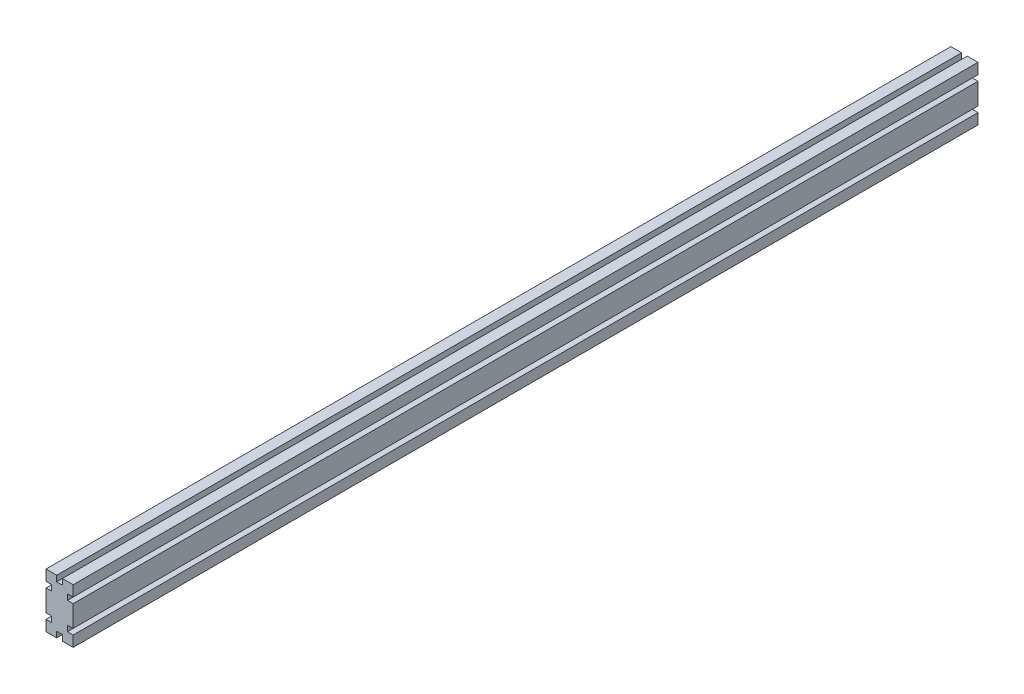
ISO-10303-21;
HEADER;
FILE_DESCRIPTION(('STEP AP214'),'2;1');
FILE_NAME('part.step','',(''),(''),'','','');
FILE_SCHEMA(('AUTOMOTIVE_DESIGN { 1 0 10303 214 1 1 1 1 }'));
ENDSEC;
DATA;
#1=APPLICATION_CONTEXT('core data for automotive mechanical design processes');
#2=APPLICATION_PROTOCOL_DEFINITION('international standard','automotive_design',2000,#1);
#3=PRODUCT_CONTEXT('',#1,'mechanical');
#4=PRODUCT('Part','Part','',(#3));
#5=PRODUCT_RELATED_PRODUCT_CATEGORY('part','',(#4));
#6=PRODUCT_DEFINITION_FORMATION('','',#4);
#7=PRODUCT_DEFINITION_CONTEXT('part definition',#1,'design');
#8=PRODUCT_DEFINITION('design','',#6,#7);
#9=PRODUCT_DEFINITION_SHAPE('','',#8);
#10=(LENGTH_UNIT() NAMED_UNIT(*) SI_UNIT(.MILLI.,.METRE.));
#11=(NAMED_UNIT(*) PLANE_ANGLE_UNIT() SI_UNIT($,.RADIAN.));
#12=(NAMED_UNIT(*) SI_UNIT($,.STERADIAN.) SOLID_ANGLE_UNIT());
#13=UNCERTAINTY_MEASURE_WITH_UNIT(LENGTH_MEASURE(1.E-05),#10,'distance_accuracy_value','');
#14=(GEOMETRIC_REPRESENTATION_CONTEXT(3) GLOBAL_UNCERTAINTY_ASSIGNED_CONTEXT((#13)) GLOBAL_UNIT_ASSIGNED_CONTEXT((#10,
#11,#12)) REPRESENTATION_CONTEXT('',''));
#15=CARTESIAN_POINT('',(0.,0.,0.));
#16=DIRECTION('',(0.,0.,1.));
#17=DIRECTION('',(1.,0.,0.));
#18=AXIS2_PLACEMENT_3D('',#15,#16,#17);
#19=CARTESIAN_POINT('',(-19.05,-23.05,1270.));
#20=DIRECTION('',(1.,0.,0.));
#21=DIRECTION('',(0.,0.,-1.));
#22=AXIS2_PLACEMENT_3D('',#19,#20,#21);
#23=PLANE('',#22);
#24=DIRECTION('',(0.,-1.,0.));
#25=VECTOR('',#24,1.);
#26=CARTESIAN_POINT('',(-19.05,-23.05,0.));
#27=LINE('',#26,#25);
#28=CARTESIAN_POINT('',(-19.05,-23.05,0.));
#29=VERTEX_POINT('',#28);
#30=CARTESIAN_POINT('',(-19.05,-38.1,0.));
#31=VERTEX_POINT('',#30);
#32=EDGE_CURVE('E255',#29,#31,#27,.T.);
#33=ORIENTED_EDGE('',*,*,#32,.T.);
#34=DIRECTION('',(0.,0.,-1.));
#35=VECTOR('',#34,1.);
#36=CARTESIAN_POINT('',(-19.05,-38.1,1270.));
#37=LINE('',#36,#35);
#38=CARTESIAN_POINT('',(-19.05,-38.1,1270.));
#39=VERTEX_POINT('',#38);
#40=EDGE_CURVE('E11',#39,#31,#37,.T.);
#41=ORIENTED_EDGE('',*,*,#40,.F.);
#42=DIRECTION('',(0.,-1.,0.));
#43=VECTOR('',#42,1.);
#44=CARTESIAN_POINT('',(-19.05,-23.05,1270.));
#45=LINE('',#44,#43);
#46=CARTESIAN_POINT('',(-19.05,-23.05,1270.));
#47=VERTEX_POINT('',#46);
#48=EDGE_CURVE('E309',#47,#39,#45,.T.);
#49=ORIENTED_EDGE('',*,*,#48,.F.);
#50=DIRECTION('',(0.,0.,-1.));
#51=VECTOR('',#50,1.);
#52=CARTESIAN_POINT('',(-19.05,-23.05,1270.));
#53=LINE('',#52,#51);
#54=EDGE_CURVE('E251',#47,#29,#53,.T.);
#55=ORIENTED_EDGE('',*,*,#54,.T.);
#56=EDGE_LOOP('',(#33,#41,#49,#55));
#57=FACE_BOUND('',#56,.T.);
#58=ADVANCED_FACE('F39',(#57),#23,.F.);
#59=CARTESIAN_POINT('',(-19.05,-38.1,1270.));
#60=DIRECTION('',(0.,1.,0.));
#61=DIRECTION('',(0.,0.,1.));
#62=AXIS2_PLACEMENT_3D('',#59,#60,#61);
#63=PLANE('',#62);
#64=DIRECTION('',(1.,0.,0.));
#65=VECTOR('',#64,1.);
#66=CARTESIAN_POINT('',(-19.05,-38.1,0.));
#67=LINE('',#66,#65);
#68=CARTESIAN_POINT('',(-4.,-38.1,0.));
#69=VERTEX_POINT('',#68);
#70=EDGE_CURVE('E258',#31,#69,#67,.T.);
#71=ORIENTED_EDGE('',*,*,#70,.T.);
#72=DIRECTION('',(0.,0.,-1.));
#73=VECTOR('',#72,1.);
#74=CARTESIAN_POINT('',(-4.,-38.1,1270.));
#75=LINE('',#74,#73);
#76=CARTESIAN_POINT('',(-4.,-38.1,1270.));
#77=VERTEX_POINT('',#76);
#78=EDGE_CURVE('E47',#77,#69,#75,.T.);
#79=ORIENTED_EDGE('',*,*,#78,.F.);
#80=DIRECTION('',(1.,0.,0.));
#81=VECTOR('',#80,1.);
#82=CARTESIAN_POINT('',(-19.05,-38.1,1270.));
#83=LINE('',#82,#81);
#84=EDGE_CURVE('E158',#39,#77,#83,.T.);
#85=ORIENTED_EDGE('',*,*,#84,.F.);
#86=ORIENTED_EDGE('',*,*,#40,.T.);
#87=EDGE_LOOP('',(#71,#79,#85,#86));
#88=FACE_BOUND('',#87,.T.);
#89=ADVANCED_FACE('F467',(#88),#63,.F.);
#90=CARTESIAN_POINT('',(-4.,-38.1,1270.));
#91=DIRECTION('',(-1.,0.,0.));
#92=DIRECTION('',(0.,0.,1.));
#93=AXIS2_PLACEMENT_3D('',#90,#91,#92);
#94=PLANE('',#93);
#95=DIRECTION('',(0.,1.,0.));
#96=VECTOR('',#95,1.);
#97=CARTESIAN_POINT('',(-4.,-38.1,0.));
#98=LINE('',#97,#96);
#99=CARTESIAN_POINT('',(-4.,-30.1,0.));
#100=VERTEX_POINT('',#99);
#101=EDGE_CURVE('E260',#69,#100,#98,.T.);
#102=ORIENTED_EDGE('',*,*,#101,.T.);
#103=DIRECTION('',(0.,0.,-1.));
#104=VECTOR('',#103,1.);
#105=CARTESIAN_POINT('',(-4.,-30.1,1270.));
#106=LINE('',#105,#104);
#107=CARTESIAN_POINT('',(-4.,-30.1,1270.));
#108=VERTEX_POINT('',#107);
#109=EDGE_CURVE('E376',#108,#100,#106,.T.);
#110=ORIENTED_EDGE('',*,*,#109,.F.);
#111=DIRECTION('',(0.,1.,0.));
#112=VECTOR('',#111,1.);
#113=CARTESIAN_POINT('',(-4.,-38.1,1270.));
#114=LINE('',#113,#112);
#115=EDGE_CURVE('E384',#77,#108,#114,.T.);
#116=ORIENTED_EDGE('',*,*,#115,.F.);
#117=ORIENTED_EDGE('',*,*,#78,.T.);
#118=EDGE_LOOP('',(#102,#110,#116,#117));
#119=FACE_BOUND('',#118,.T.);
#120=ADVANCED_FACE('F382',(#119),#94,.F.);
#121=CARTESIAN_POINT('',(-4.,-30.1,1270.));
#122=DIRECTION('',(0.,1.,0.));
#123=DIRECTION('',(0.,0.,1.));
#124=AXIS2_PLACEMENT_3D('',#121,#122,#123);
#125=PLANE('',#124);
#126=DIRECTION('',(1.,0.,0.));
#127=VECTOR('',#126,1.);
#128=CARTESIAN_POINT('',(-4.,-30.1,0.));
#129=LINE('',#128,#127);
#130=CARTESIAN_POINT('',(4.,-30.1,0.));
#131=VERTEX_POINT('',#130);
#132=EDGE_CURVE('E262',#100,#131,#129,.T.);
#133=ORIENTED_EDGE('',*,*,#132,.T.);
#134=DIRECTION('',(0.,0.,-1.));
#135=VECTOR('',#134,1.);
#136=CARTESIAN_POINT('',(4.,-30.1,1270.));
#137=LINE('',#136,#135);
#138=CARTESIAN_POINT('',(4.,-30.1,1270.));
#139=VERTEX_POINT('',#138);
#140=EDGE_CURVE('E373',#139,#131,#137,.T.);
#141=ORIENTED_EDGE('',*,*,#140,.F.);
#142=DIRECTION('',(1.,0.,0.));
#143=VECTOR('',#142,1.);
#144=CARTESIAN_POINT('',(-4.,-30.1,1270.));
#145=LINE('',#144,#143);
#146=EDGE_CURVE('E402',#108,#139,#145,.T.);
#147=ORIENTED_EDGE('',*,*,#146,.F.);
#148=ORIENTED_EDGE('',*,*,#109,.T.);
#149=EDGE_LOOP('',(#133,#141,#147,#148));
#150=FACE_BOUND('',#149,.T.);
#151=ADVANCED_FACE('F393',(#150),#125,.F.);
#152=CARTESIAN_POINT('',(4.,-30.1,1270.));
#153=DIRECTION('',(1.,0.,0.));
#154=DIRECTION('',(0.,0.,-1.));
#155=AXIS2_PLACEMENT_3D('',#152,#153,#154);
#156=PLANE('',#155);
#157=DIRECTION('',(0.,-1.,0.));
#158=VECTOR('',#157,1.);
#159=CARTESIAN_POINT('',(4.,-30.1,0.));
#160=LINE('',#159,#158);
#161=CARTESIAN_POINT('',(4.,-38.1,0.));
#162=VERTEX_POINT('',#161);
#163=EDGE_CURVE('E264',#131,#162,#160,.T.);
#164=ORIENTED_EDGE('',*,*,#163,.T.);
#165=DIRECTION('',(0.,0.,-1.));
#166=VECTOR('',#165,1.);
#167=CARTESIAN_POINT('',(4.,-38.1,1270.));
#168=LINE('',#167,#166);
#169=CARTESIAN_POINT('',(4.,-38.1,1270.));
#170=VERTEX_POINT('',#169);
#171=EDGE_CURVE('E370',#170,#162,#168,.T.);
#172=ORIENTED_EDGE('',*,*,#171,.F.);
#173=DIRECTION('',(0.,-1.,0.));
#174=VECTOR('',#173,1.);
#175=CARTESIAN_POINT('',(4.,-30.1,1270.));
#176=LINE('',#175,#174);
#177=EDGE_CURVE('E399',#139,#170,#176,.T.);
#178=ORIENTED_EDGE('',*,*,#177,.F.);
#179=ORIENTED_EDGE('',*,*,#140,.T.);
#180=EDGE_LOOP('',(#164,#172,#178,#179));
#181=FACE_BOUND('',#180,.T.);
#182=ADVANCED_FACE('F397',(#181),#156,.F.);
#183=CARTESIAN_POINT('',(4.,-38.1,1270.));
#184=DIRECTION('',(0.,1.,0.));
#185=DIRECTION('',(0.,0.,1.));
#186=AXIS2_PLACEMENT_3D('',#183,#184,#185);
#187=PLANE('',#186);
#188=DIRECTION('',(1.,0.,0.));
#189=VECTOR('',#188,1.);
#190=CARTESIAN_POINT('',(4.,-38.1,0.));
#191=LINE('',#190,#189);
#192=CARTESIAN_POINT('',(19.05,-38.1,0.));
#193=VERTEX_POINT('',#192);
#194=EDGE_CURVE('E266',#162,#193,#191,.T.);
#195=ORIENTED_EDGE('',*,*,#194,.T.);
#196=DIRECTION('',(0.,0.,-1.));
#197=VECTOR('',#196,1.);
#198=CARTESIAN_POINT('',(19.05,-38.1,1270.));
#199=LINE('',#198,#197);
#200=CARTESIAN_POINT('',(19.05,-38.1,1270.));
#201=VERTEX_POINT('',#200);
#202=EDGE_CURVE('E367',#201,#193,#199,.T.);
#203=ORIENTED_EDGE('',*,*,#202,.F.);
#204=DIRECTION('',(1.,0.,0.));
#205=VECTOR('',#204,1.);
#206=CARTESIAN_POINT('',(4.,-38.1,1270.));
#207=LINE('',#206,#205);
#208=EDGE_CURVE('E401',#170,#201,#207,.T.);
#209=ORIENTED_EDGE('',*,*,#208,.F.);
#210=ORIENTED_EDGE('',*,*,#171,.T.);
#211=EDGE_LOOP('',(#195,#203,#209,#210));
#212=FACE_BOUND('',#211,.T.);
#213=ADVANCED_FACE('F480',(#212),#187,.F.);
#214=CARTESIAN_POINT('',(19.05,-38.1,1270.));
#215=DIRECTION('',(-1.,0.,0.));
#216=DIRECTION('',(0.,0.,1.));
#217=AXIS2_PLACEMENT_3D('',#214,#215,#216);
#218=PLANE('',#217);
#219=DIRECTION('',(0.,1.,0.));
#220=VECTOR('',#219,1.);
#221=CARTESIAN_POINT('',(19.05,-38.1,0.));
#222=LINE('',#221,#220);
#223=CARTESIAN_POINT('',(19.05,-23.05,0.));
#224=VERTEX_POINT('',#223);
#225=EDGE_CURVE('E268',#193,#224,#222,.T.);
#226=ORIENTED_EDGE('',*,*,#225,.T.);
#227=DIRECTION('',(0.,0.,-1.));
#228=VECTOR('',#227,1.);
#229=CARTESIAN_POINT('',(19.05,-23.05,1270.));
#230=LINE('',#229,#228);
#231=CARTESIAN_POINT('',(19.05,-23.05,1270.));
#232=VERTEX_POINT('',#231);
#233=EDGE_CURVE('E364',#232,#224,#230,.T.);
#234=ORIENTED_EDGE('',*,*,#233,.F.);
#235=DIRECTION('',(0.,1.,0.));
#236=VECTOR('',#235,1.);
#237=CARTESIAN_POINT('',(19.05,-38.1,1270.));
#238=LINE('',#237,#236);
#239=EDGE_CURVE('E404',#201,#232,#238,.T.);
#240=ORIENTED_EDGE('',*,*,#239,.F.);
#241=ORIENTED_EDGE('',*,*,#202,.T.);
#242=EDGE_LOOP('',(#226,#234,#240,#241));
#243=FACE_BOUND('',#242,.T.);
#244=ADVANCED_FACE('F483',(#243),#218,.F.);
#245=CARTESIAN_POINT('',(19.05,-23.05,1270.));
#246=DIRECTION('',(0.,-1.,0.));
#247=DIRECTION('',(0.,0.,-1.));
#248=AXIS2_PLACEMENT_3D('',#245,#246,#247);
#249=PLANE('',#248);
#250=DIRECTION('',(-1.,0.,0.));
#251=VECTOR('',#250,1.);
#252=CARTESIAN_POINT('',(19.05,-23.05,0.));
#253=LINE('',#252,#251);
#254=CARTESIAN_POINT('',(11.05,-23.05,0.));
#255=VERTEX_POINT('',#254);
#256=EDGE_CURVE('E270',#224,#255,#253,.T.);
#257=ORIENTED_EDGE('',*,*,#256,.T.);
#258=DIRECTION('',(0.,0.,-1.));
#259=VECTOR('',#258,1.);
#260=CARTESIAN_POINT('',(11.05,-23.05,1270.));
#261=LINE('',#260,#259);
#262=CARTESIAN_POINT('',(11.05,-23.05,1270.));
#263=VERTEX_POINT('',#262);
#264=EDGE_CURVE('E361',#263,#255,#261,.T.);
#265=ORIENTED_EDGE('',*,*,#264,.F.);
#266=DIRECTION('',(-1.,0.,0.));
#267=VECTOR('',#266,1.);
#268=CARTESIAN_POINT('',(19.05,-23.05,1270.));
#269=LINE('',#268,#267);
#270=EDGE_CURVE('E410',#232,#263,#269,.T.);
#271=ORIENTED_EDGE('',*,*,#270,.F.);
#272=ORIENTED_EDGE('',*,*,#233,.T.);
#273=EDGE_LOOP('',(#257,#265,#271,#272));
#274=FACE_BOUND('',#273,.T.);
#275=ADVANCED_FACE('F487',(#274),#249,.F.);
#276=CARTESIAN_POINT('',(11.05,-23.05,1270.));
#277=DIRECTION('',(-1.,0.,0.));
#278=DIRECTION('',(0.,0.,1.));
#279=AXIS2_PLACEMENT_3D('',#276,#277,#278);
#280=PLANE('',#279);
#281=DIRECTION('',(0.,1.,0.));
#282=VECTOR('',#281,1.);
#283=CARTESIAN_POINT('',(11.05,-23.05,0.));
#284=LINE('',#283,#282);
#285=CARTESIAN_POINT('',(11.05,-15.05,0.));
#286=VERTEX_POINT('',#285);
#287=EDGE_CURVE('E272',#255,#286,#284,.T.);
#288=ORIENTED_EDGE('',*,*,#287,.T.);
#289=DIRECTION('',(0.,0.,-1.));
#290=VECTOR('',#289,1.);
#291=CARTESIAN_POINT('',(11.05,-15.05,1270.));
#292=LINE('',#291,#290);
#293=CARTESIAN_POINT('',(11.05,-15.05,1270.));
#294=VERTEX_POINT('',#293);
#295=EDGE_CURVE('E358',#294,#286,#292,.T.);
#296=ORIENTED_EDGE('',*,*,#295,.F.);
#297=DIRECTION('',(0.,1.,0.));
#298=VECTOR('',#297,1.);
#299=CARTESIAN_POINT('',(11.05,-23.05,1270.));
#300=LINE('',#299,#298);
#301=EDGE_CURVE('E412',#263,#294,#300,.T.);
#302=ORIENTED_EDGE('',*,*,#301,.F.);
#303=ORIENTED_EDGE('',*,*,#264,.T.);
#304=EDGE_LOOP('',(#288,#296,#302,#303));
#305=FACE_BOUND('',#304,.T.);
#306=ADVANCED_FACE('F491',(#305),#280,.F.);
#307=CARTESIAN_POINT('',(11.05,-15.05,1270.));
#308=DIRECTION('',(0.,1.,0.));
#309=DIRECTION('',(0.,0.,1.));
#310=AXIS2_PLACEMENT_3D('',#307,#308,#309);
#311=PLANE('',#310);
#312=DIRECTION('',(1.,0.,0.));
#313=VECTOR('',#312,1.);
#314=CARTESIAN_POINT('',(11.05,-15.05,0.));
#315=LINE('',#314,#313);
#316=CARTESIAN_POINT('',(19.05,-15.05,0.));
#317=VERTEX_POINT('',#316);
#318=EDGE_CURVE('E274',#286,#317,#315,.T.);
#319=ORIENTED_EDGE('',*,*,#318,.T.);
#320=DIRECTION('',(0.,0.,-1.));
#321=VECTOR('',#320,1.);
#322=CARTESIAN_POINT('',(19.05,-15.05,1270.));
#323=LINE('',#322,#321);
#324=CARTESIAN_POINT('',(19.05,-15.05,1270.));
#325=VERTEX_POINT('',#324);
#326=EDGE_CURVE('E355',#325,#317,#323,.T.);
#327=ORIENTED_EDGE('',*,*,#326,.F.);
#328=DIRECTION('',(1.,0.,0.));
#329=VECTOR('',#328,1.);
#330=CARTESIAN_POINT('',(11.05,-15.05,1270.));
#331=LINE('',#330,#329);
#332=EDGE_CURVE('E414',#294,#325,#331,.T.);
#333=ORIENTED_EDGE('',*,*,#332,.F.);
#334=ORIENTED_EDGE('',*,*,#295,.T.);
#335=EDGE_LOOP('',(#319,#327,#333,#334));
#336=FACE_BOUND('',#335,.T.);
#337=ADVANCED_FACE('F495',(#336),#311,.F.);
#338=CARTESIAN_POINT('',(19.05,-15.05,1270.));
#339=DIRECTION('',(-1.,0.,0.));
#340=DIRECTION('',(0.,0.,1.));
#341=AXIS2_PLACEMENT_3D('',#338,#339,#340);
#342=PLANE('',#341);
#343=DIRECTION('',(0.,1.,0.));
#344=VECTOR('',#343,1.);
#345=CARTESIAN_POINT('',(19.05,-15.05,0.));
#346=LINE('',#345,#344);
#347=CARTESIAN_POINT('',(19.05,15.05,0.));
#348=VERTEX_POINT('',#347);
#349=EDGE_CURVE('E276',#317,#348,#346,.T.);
#350=ORIENTED_EDGE('',*,*,#349,.T.);
#351=DIRECTION('',(0.,0.,-1.));
#352=VECTOR('',#351,1.);
#353=CARTESIAN_POINT('',(19.05,15.05,1270.));
#354=LINE('',#353,#352);
#355=CARTESIAN_POINT('',(19.05,15.05,1270.));
#356=VERTEX_POINT('',#355);
#357=EDGE_CURVE('E352',#356,#348,#354,.T.);
#358=ORIENTED_EDGE('',*,*,#357,.F.);
#359=DIRECTION('',(0.,1.,0.));
#360=VECTOR('',#359,1.);
#361=CARTESIAN_POINT('',(19.05,-15.05,1270.));
#362=LINE('',#361,#360);
#363=EDGE_CURVE('E416',#325,#356,#362,.T.);
#364=ORIENTED_EDGE('',*,*,#363,.F.);
#365=ORIENTED_EDGE('',*,*,#326,.T.);
#366=EDGE_LOOP('',(#350,#358,#364,#365));
#367=FACE_BOUND('',#366,.T.);
#368=ADVANCED_FACE('F499',(#367),#342,.F.);
#369=CARTESIAN_POINT('',(19.05,15.05,1270.));
#370=DIRECTION('',(0.,-1.,0.));
#371=DIRECTION('',(0.,0.,-1.));
#372=AXIS2_PLACEMENT_3D('',#369,#370,#371);
#373=PLANE('',#372);
#374=DIRECTION('',(-1.,0.,0.));
#375=VECTOR('',#374,1.);
#376=CARTESIAN_POINT('',(19.05,15.05,0.));
#377=LINE('',#376,#375);
#378=CARTESIAN_POINT('',(11.05,15.05,0.));
#379=VERTEX_POINT('',#378);
#380=EDGE_CURVE('E278',#348,#379,#377,.T.);
#381=ORIENTED_EDGE('',*,*,#380,.T.);
#382=DIRECTION('',(0.,0.,-1.));
#383=VECTOR('',#382,1.);
#384=CARTESIAN_POINT('',(11.05,15.05,1270.));
#385=LINE('',#384,#383);
#386=CARTESIAN_POINT('',(11.05,15.05,1270.));
#387=VERTEX_POINT('',#386);
#388=EDGE_CURVE('E349',#387,#379,#385,.T.);
#389=ORIENTED_EDGE('',*,*,#388,.F.);
#390=DIRECTION('',(-1.,0.,0.));
#391=VECTOR('',#390,1.);
#392=CARTESIAN_POINT('',(19.05,15.05,1270.));
#393=LINE('',#392,#391);
#394=EDGE_CURVE('E418',#356,#387,#393,.T.);
#395=ORIENTED_EDGE('',*,*,#394,.F.);
#396=ORIENTED_EDGE('',*,*,#357,.T.);
#397=EDGE_LOOP('',(#381,#389,#395,#396));
#398=FACE_BOUND('',#397,.T.);
#399=ADVANCED_FACE('F503',(#398),#373,.F.);
#400=CARTESIAN_POINT('',(11.05,15.05,1270.));
#401=DIRECTION('',(-1.,0.,0.));
#402=DIRECTION('',(0.,0.,1.));
#403=AXIS2_PLACEMENT_3D('',#400,#401,#402);
#404=PLANE('',#403);
#405=DIRECTION('',(0.,1.,0.));
#406=VECTOR('',#405,1.);
#407=CARTESIAN_POINT('',(11.05,15.05,0.));
#408=LINE('',#407,#406);
#409=CARTESIAN_POINT('',(11.05,23.05,0.));
#410=VERTEX_POINT('',#409);
#411=EDGE_CURVE('E280',#379,#410,#408,.T.);
#412=ORIENTED_EDGE('',*,*,#411,.T.);
#413=DIRECTION('',(0.,0.,-1.));
#414=VECTOR('',#413,1.);
#415=CARTESIAN_POINT('',(11.05,23.05,1270.));
#416=LINE('',#415,#414);
#417=CARTESIAN_POINT('',(11.05,23.05,1270.));
#418=VERTEX_POINT('',#417);
#419=EDGE_CURVE('E346',#418,#410,#416,.T.);
#420=ORIENTED_EDGE('',*,*,#419,.F.);
#421=DIRECTION('',(0.,1.,0.));
#422=VECTOR('',#421,1.);
#423=CARTESIAN_POINT('',(11.05,15.05,1270.));
#424=LINE('',#423,#422);
#425=EDGE_CURVE('E420',#387,#418,#424,.T.);
#426=ORIENTED_EDGE('',*,*,#425,.F.);
#427=ORIENTED_EDGE('',*,*,#388,.T.);
#428=EDGE_LOOP('',(#412,#420,#426,#427));
#429=FACE_BOUND('',#428,.T.);
#430=ADVANCED_FACE('F507',(#429),#404,.F.);
#431=CARTESIAN_POINT('',(11.05,23.05,1270.));
#432=DIRECTION('',(0.,1.,0.));
#433=DIRECTION('',(0.,0.,1.));
#434=AXIS2_PLACEMENT_3D('',#431,#432,#433);
#435=PLANE('',#434);
#436=DIRECTION('',(1.,0.,0.));
#437=VECTOR('',#436,1.);
#438=CARTESIAN_POINT('',(11.05,23.05,0.));
#439=LINE('',#438,#437);
#440=CARTESIAN_POINT('',(19.05,23.05,0.));
#441=VERTEX_POINT('',#440);
#442=EDGE_CURVE('E282',#410,#441,#439,.T.);
#443=ORIENTED_EDGE('',*,*,#442,.T.);
#444=DIRECTION('',(0.,0.,-1.));
#445=VECTOR('',#444,1.);
#446=CARTESIAN_POINT('',(19.05,23.05,1270.));
#447=LINE('',#446,#445);
#448=CARTESIAN_POINT('',(19.05,23.05,1270.));
#449=VERTEX_POINT('',#448);
#450=EDGE_CURVE('E343',#449,#441,#447,.T.);
#451=ORIENTED_EDGE('',*,*,#450,.F.);
#452=DIRECTION('',(1.,0.,0.));
#453=VECTOR('',#452,1.);
#454=CARTESIAN_POINT('',(11.05,23.05,1270.));
#455=LINE('',#454,#453);
#456=EDGE_CURVE('E422',#418,#449,#455,.T.);
#457=ORIENTED_EDGE('',*,*,#456,.F.);
#458=ORIENTED_EDGE('',*,*,#419,.T.);
#459=EDGE_LOOP('',(#443,#451,#457,#458));
#460=FACE_BOUND('',#459,.T.);
#461=ADVANCED_FACE('F511',(#460),#435,.F.);
#462=CARTESIAN_POINT('',(19.05,23.05,1270.));
#463=DIRECTION('',(-1.,0.,0.));
#464=DIRECTION('',(0.,0.,1.));
#465=AXIS2_PLACEMENT_3D('',#462,#463,#464);
#466=PLANE('',#465);
#467=DIRECTION('',(0.,1.,0.));
#468=VECTOR('',#467,1.);
#469=CARTESIAN_POINT('',(19.05,23.05,0.));
#470=LINE('',#469,#468);
#471=CARTESIAN_POINT('',(19.05,38.1,0.));
#472=VERTEX_POINT('',#471);
#473=EDGE_CURVE('E284',#441,#472,#470,.T.);
#474=ORIENTED_EDGE('',*,*,#473,.T.);
#475=DIRECTION('',(0.,0.,-1.));
#476=VECTOR('',#475,1.);
#477=CARTESIAN_POINT('',(19.05,38.1,1270.));
#478=LINE('',#477,#476);
#479=CARTESIAN_POINT('',(19.05,38.1,1270.));
#480=VERTEX_POINT('',#479);
#481=EDGE_CURVE('E340',#480,#472,#478,.T.);
#482=ORIENTED_EDGE('',*,*,#481,.F.);
#483=DIRECTION('',(0.,1.,0.));
#484=VECTOR('',#483,1.);
#485=CARTESIAN_POINT('',(19.05,23.05,1270.));
#486=LINE('',#485,#484);
#487=EDGE_CURVE('E424',#449,#480,#486,.T.);
#488=ORIENTED_EDGE('',*,*,#487,.F.);
#489=ORIENTED_EDGE('',*,*,#450,.T.);
#490=EDGE_LOOP('',(#474,#482,#488,#489));
#491=FACE_BOUND('',#490,.T.);
#492=ADVANCED_FACE('F515',(#491),#466,.F.);
#493=CARTESIAN_POINT('',(19.05,38.1,1270.));
#494=DIRECTION('',(0.,-1.,0.));
#495=DIRECTION('',(0.,0.,-1.));
#496=AXIS2_PLACEMENT_3D('',#493,#494,#495);
#497=PLANE('',#496);
#498=DIRECTION('',(-1.,0.,0.));
#499=VECTOR('',#498,1.);
#500=CARTESIAN_POINT('',(19.05,38.1,0.));
#501=LINE('',#500,#499);
#502=CARTESIAN_POINT('',(4.,38.1,0.));
#503=VERTEX_POINT('',#502);
#504=EDGE_CURVE('E286',#472,#503,#501,.T.);
#505=ORIENTED_EDGE('',*,*,#504,.T.);
#506=DIRECTION('',(0.,0.,-1.));
#507=VECTOR('',#506,1.);
#508=CARTESIAN_POINT('',(4.,38.1,1270.));
#509=LINE('',#508,#507);
#510=CARTESIAN_POINT('',(4.,38.1,1270.));
#511=VERTEX_POINT('',#510);
#512=EDGE_CURVE('E337',#511,#503,#509,.T.);
#513=ORIENTED_EDGE('',*,*,#512,.F.);
#514=DIRECTION('',(-1.,0.,0.));
#515=VECTOR('',#514,1.);
#516=CARTESIAN_POINT('',(19.05,38.1,1270.));
#517=LINE('',#516,#515);
#518=EDGE_CURVE('E426',#480,#511,#517,.T.);
#519=ORIENTED_EDGE('',*,*,#518,.F.);
#520=ORIENTED_EDGE('',*,*,#481,.T.);
#521=EDGE_LOOP('',(#505,#513,#519,#520));
#522=FACE_BOUND('',#521,.T.);
#523=ADVANCED_FACE('F519',(#522),#497,.F.);
#524=CARTESIAN_POINT('',(4.,38.1,1270.));
#525=DIRECTION('',(1.,0.,0.));
#526=DIRECTION('',(0.,0.,-1.));
#527=AXIS2_PLACEMENT_3D('',#524,#525,#526);
#528=PLANE('',#527);
#529=DIRECTION('',(0.,-1.,0.));
#530=VECTOR('',#529,1.);
#531=CARTESIAN_POINT('',(4.,38.1,0.));
#532=LINE('',#531,#530);
#533=CARTESIAN_POINT('',(4.,30.1,0.));
#534=VERTEX_POINT('',#533);
#535=EDGE_CURVE('E288',#503,#534,#532,.T.);
#536=ORIENTED_EDGE('',*,*,#535,.T.);
#537=DIRECTION('',(0.,0.,-1.));
#538=VECTOR('',#537,1.);
#539=CARTESIAN_POINT('',(4.,30.1,1270.));
#540=LINE('',#539,#538);
#541=CARTESIAN_POINT('',(4.,30.1,1270.));
#542=VERTEX_POINT('',#541);
#543=EDGE_CURVE('E334',#542,#534,#540,.T.);
#544=ORIENTED_EDGE('',*,*,#543,.F.);
#545=DIRECTION('',(0.,-1.,0.));
#546=VECTOR('',#545,1.);
#547=CARTESIAN_POINT('',(4.,38.1,1270.));
#548=LINE('',#547,#546);
#549=EDGE_CURVE('E428',#511,#542,#548,.T.);
#550=ORIENTED_EDGE('',*,*,#549,.F.);
#551=ORIENTED_EDGE('',*,*,#512,.T.);
#552=EDGE_LOOP('',(#536,#544,#550,#551));
#553=FACE_BOUND('',#552,.T.);
#554=ADVANCED_FACE('F523',(#553),#528,.F.);
#555=CARTESIAN_POINT('',(4.,30.1,1270.));
#556=DIRECTION('',(0.,-1.,0.));
#557=DIRECTION('',(0.,0.,-1.));
#558=AXIS2_PLACEMENT_3D('',#555,#556,#557);
#559=PLANE('',#558);
#560=DIRECTION('',(-1.,0.,0.));
#561=VECTOR('',#560,1.);
#562=CARTESIAN_POINT('',(4.,30.1,0.));
#563=LINE('',#562,#561);
#564=CARTESIAN_POINT('',(-4.,30.1,0.));
#565=VERTEX_POINT('',#564);
#566=EDGE_CURVE('E290',#534,#565,#563,.T.);
#567=ORIENTED_EDGE('',*,*,#566,.T.);
#568=DIRECTION('',(0.,0.,-1.));
#569=VECTOR('',#568,1.);
#570=CARTESIAN_POINT('',(-4.,30.1,1270.));
#571=LINE('',#570,#569);
#572=CARTESIAN_POINT('',(-4.,30.1,1270.));
#573=VERTEX_POINT('',#572);
#574=EDGE_CURVE('E331',#573,#565,#571,.T.);
#575=ORIENTED_EDGE('',*,*,#574,.F.);
#576=DIRECTION('',(-1.,0.,0.));
#577=VECTOR('',#576,1.);
#578=CARTESIAN_POINT('',(4.,30.1,1270.));
#579=LINE('',#578,#577);
#580=EDGE_CURVE('E430',#542,#573,#579,.T.);
#581=ORIENTED_EDGE('',*,*,#580,.F.);
#582=ORIENTED_EDGE('',*,*,#543,.T.);
#583=EDGE_LOOP('',(#567,#575,#581,#582));
#584=FACE_BOUND('',#583,.T.);
#585=ADVANCED_FACE('F527',(#584),#559,.F.);
#586=CARTESIAN_POINT('',(-4.,30.1,1270.));
#587=DIRECTION('',(-1.,0.,0.));
#588=DIRECTION('',(0.,0.,1.));
#589=AXIS2_PLACEMENT_3D('',#586,#587,#588);
#590=PLANE('',#589);
#591=DIRECTION('',(0.,1.,0.));
#592=VECTOR('',#591,1.);
#593=CARTESIAN_POINT('',(-4.,30.1,0.));
#594=LINE('',#593,#592);
#595=CARTESIAN_POINT('',(-4.,38.1,0.));
#596=VERTEX_POINT('',#595);
#597=EDGE_CURVE('E292',#565,#596,#594,.T.);
#598=ORIENTED_EDGE('',*,*,#597,.T.);
#599=DIRECTION('',(0.,0.,-1.));
#600=VECTOR('',#599,1.);
#601=CARTESIAN_POINT('',(-4.,38.1,1270.));
#602=LINE('',#601,#600);
#603=CARTESIAN_POINT('',(-4.,38.1,1270.));
#604=VERTEX_POINT('',#603);
#605=EDGE_CURVE('E328',#604,#596,#602,.T.);
#606=ORIENTED_EDGE('',*,*,#605,.F.);
#607=DIRECTION('',(0.,1.,0.));
#608=VECTOR('',#607,1.);
#609=CARTESIAN_POINT('',(-4.,30.1,1270.));
#610=LINE('',#609,#608);
#611=EDGE_CURVE('E432',#573,#604,#610,.T.);
#612=ORIENTED_EDGE('',*,*,#611,.F.);
#613=ORIENTED_EDGE('',*,*,#574,.T.);
#614=EDGE_LOOP('',(#598,#606,#612,#613));
#615=FACE_BOUND('',#614,.T.);
#616=ADVANCED_FACE('F531',(#615),#590,.F.);
#617=CARTESIAN_POINT('',(-4.,38.1,1270.));
#618=DIRECTION('',(0.,-1.,0.));
#619=DIRECTION('',(0.,0.,-1.));
#620=AXIS2_PLACEMENT_3D('',#617,#618,#619);
#621=PLANE('',#620);
#622=DIRECTION('',(-1.,0.,0.));
#623=VECTOR('',#622,1.);
#624=CARTESIAN_POINT('',(-4.,38.1,0.));
#625=LINE('',#624,#623);
#626=CARTESIAN_POINT('',(-19.05,38.1,0.));
#627=VERTEX_POINT('',#626);
#628=EDGE_CURVE('E294',#596,#627,#625,.T.);
#629=ORIENTED_EDGE('',*,*,#628,.T.);
#630=DIRECTION('',(0.,0.,-1.));
#631=VECTOR('',#630,1.);
#632=CARTESIAN_POINT('',(-19.05,38.1,1270.));
#633=LINE('',#632,#631);
#634=CARTESIAN_POINT('',(-19.05,38.1,1270.));
#635=VERTEX_POINT('',#634);
#636=EDGE_CURVE('E325',#635,#627,#633,.T.);
#637=ORIENTED_EDGE('',*,*,#636,.F.);
#638=DIRECTION('',(-1.,0.,0.));
#639=VECTOR('',#638,1.);
#640=CARTESIAN_POINT('',(-4.,38.1,1270.));
#641=LINE('',#640,#639);
#642=EDGE_CURVE('E434',#604,#635,#641,.T.);
#643=ORIENTED_EDGE('',*,*,#642,.F.);
#644=ORIENTED_EDGE('',*,*,#605,.T.);
#645=EDGE_LOOP('',(#629,#637,#643,#644));
#646=FACE_BOUND('',#645,.T.);
#647=ADVANCED_FACE('F535',(#646),#621,.F.);
#648=CARTESIAN_POINT('',(-19.05,38.1,1270.));
#649=DIRECTION('',(1.,0.,0.));
#650=DIRECTION('',(0.,0.,-1.));
#651=AXIS2_PLACEMENT_3D('',#648,#649,#650);
#652=PLANE('',#651);
#653=DIRECTION('',(0.,-1.,0.));
#654=VECTOR('',#653,1.);
#655=CARTESIAN_POINT('',(-19.05,38.1,0.));
#656=LINE('',#655,#654);
#657=CARTESIAN_POINT('',(-19.05,23.05,0.));
#658=VERTEX_POINT('',#657);
#659=EDGE_CURVE('E296',#627,#658,#656,.T.);
#660=ORIENTED_EDGE('',*,*,#659,.T.);
#661=DIRECTION('',(0.,0.,-1.));
#662=VECTOR('',#661,1.);
#663=CARTESIAN_POINT('',(-19.05,23.05,1270.));
#664=LINE('',#663,#662);
#665=CARTESIAN_POINT('',(-19.05,23.05,1270.));
#666=VERTEX_POINT('',#665);
#667=EDGE_CURVE('E322',#666,#658,#664,.T.);
#668=ORIENTED_EDGE('',*,*,#667,.F.);
#669=DIRECTION('',(0.,-1.,0.));
#670=VECTOR('',#669,1.);
#671=CARTESIAN_POINT('',(-19.05,38.1,1270.));
#672=LINE('',#671,#670);
#673=EDGE_CURVE('E436',#635,#666,#672,.T.);
#674=ORIENTED_EDGE('',*,*,#673,.F.);
#675=ORIENTED_EDGE('',*,*,#636,.T.);
#676=EDGE_LOOP('',(#660,#668,#674,#675));
#677=FACE_BOUND('',#676,.T.);
#678=ADVANCED_FACE('F539',(#677),#652,.F.);
#679=CARTESIAN_POINT('',(-19.05,23.05,1270.));
#680=DIRECTION('',(0.,1.,0.));
#681=DIRECTION('',(0.,0.,1.));
#682=AXIS2_PLACEMENT_3D('',#679,#680,#681);
#683=PLANE('',#682);
#684=DIRECTION('',(1.,0.,0.));
#685=VECTOR('',#684,1.);
#686=CARTESIAN_POINT('',(-19.05,23.05,0.));
#687=LINE('',#686,#685);
#688=CARTESIAN_POINT('',(-11.05,23.05,0.));
#689=VERTEX_POINT('',#688);
#690=EDGE_CURVE('E298',#658,#689,#687,.T.);
#691=ORIENTED_EDGE('',*,*,#690,.T.);
#692=DIRECTION('',(0.,0.,-1.));
#693=VECTOR('',#692,1.);
#694=CARTESIAN_POINT('',(-11.05,23.05,1270.));
#695=LINE('',#694,#693);
#696=CARTESIAN_POINT('',(-11.05,23.05,1270.));
#697=VERTEX_POINT('',#696);
#698=EDGE_CURVE('E319',#697,#689,#695,.T.);
#699=ORIENTED_EDGE('',*,*,#698,.F.);
#700=DIRECTION('',(1.,0.,0.));
#701=VECTOR('',#700,1.);
#702=CARTESIAN_POINT('',(-19.05,23.05,1270.));
#703=LINE('',#702,#701);
#704=EDGE_CURVE('E438',#666,#697,#703,.T.);
#705=ORIENTED_EDGE('',*,*,#704,.F.);
#706=ORIENTED_EDGE('',*,*,#667,.T.);
#707=EDGE_LOOP('',(#691,#699,#705,#706));
#708=FACE_BOUND('',#707,.T.);
#709=ADVANCED_FACE('F543',(#708),#683,.F.);
#710=CARTESIAN_POINT('',(-11.05,23.05,1270.));
#711=DIRECTION('',(1.,0.,0.));
#712=DIRECTION('',(0.,0.,-1.));
#713=AXIS2_PLACEMENT_3D('',#710,#711,#712);
#714=PLANE('',#713);
#715=DIRECTION('',(0.,-1.,0.));
#716=VECTOR('',#715,1.);
#717=CARTESIAN_POINT('',(-11.05,23.05,0.));
#718=LINE('',#717,#716);
#719=CARTESIAN_POINT('',(-11.05,15.05,0.));
#720=VERTEX_POINT('',#719);
#721=EDGE_CURVE('E300',#689,#720,#718,.T.);
#722=ORIENTED_EDGE('',*,*,#721,.T.);
#723=DIRECTION('',(0.,0.,-1.));
#724=VECTOR('',#723,1.);
#725=CARTESIAN_POINT('',(-11.05,15.05,1270.));
#726=LINE('',#725,#724);
#727=CARTESIAN_POINT('',(-11.05,15.05,1270.));
#728=VERTEX_POINT('',#727);
#729=EDGE_CURVE('E316',#728,#720,#726,.T.);
#730=ORIENTED_EDGE('',*,*,#729,.F.);
#731=DIRECTION('',(0.,-1.,0.));
#732=VECTOR('',#731,1.);
#733=CARTESIAN_POINT('',(-11.05,23.05,1270.));
#734=LINE('',#733,#732);
#735=EDGE_CURVE('E440',#697,#728,#734,.T.);
#736=ORIENTED_EDGE('',*,*,#735,.F.);
#737=ORIENTED_EDGE('',*,*,#698,.T.);
#738=EDGE_LOOP('',(#722,#730,#736,#737));
#739=FACE_BOUND('',#738,.T.);
#740=ADVANCED_FACE('F547',(#739),#714,.F.);
#741=CARTESIAN_POINT('',(-11.05,15.05,1270.));
#742=DIRECTION('',(0.,-1.,0.));
#743=DIRECTION('',(0.,0.,-1.));
#744=AXIS2_PLACEMENT_3D('',#741,#742,#743);
#745=PLANE('',#744);
#746=DIRECTION('',(-1.,0.,0.));
#747=VECTOR('',#746,1.);
#748=CARTESIAN_POINT('',(-11.05,15.05,0.));
#749=LINE('',#748,#747);
#750=CARTESIAN_POINT('',(-19.05,15.05,0.));
#751=VERTEX_POINT('',#750);
#752=EDGE_CURVE('E302',#720,#751,#749,.T.);
#753=ORIENTED_EDGE('',*,*,#752,.T.);
#754=DIRECTION('',(0.,0.,-1.));
#755=VECTOR('',#754,1.);
#756=CARTESIAN_POINT('',(-19.05,15.05,1270.));
#757=LINE('',#756,#755);
#758=CARTESIAN_POINT('',(-19.05,15.05,1270.));
#759=VERTEX_POINT('',#758);
#760=EDGE_CURVE('E313',#759,#751,#757,.T.);
#761=ORIENTED_EDGE('',*,*,#760,.F.);
#762=DIRECTION('',(-1.,0.,0.));
#763=VECTOR('',#762,1.);
#764=CARTESIAN_POINT('',(-11.05,15.05,1270.));
#765=LINE('',#764,#763);
#766=EDGE_CURVE('E442',#728,#759,#765,.T.);
#767=ORIENTED_EDGE('',*,*,#766,.F.);
#768=ORIENTED_EDGE('',*,*,#729,.T.);
#769=EDGE_LOOP('',(#753,#761,#767,#768));
#770=FACE_BOUND('',#769,.T.);
#771=ADVANCED_FACE('F448',(#770),#745,.F.);
#772=CARTESIAN_POINT('',(-19.05,15.05,1270.));
#773=DIRECTION('',(1.,0.,0.));
#774=DIRECTION('',(0.,0.,-1.));
#775=AXIS2_PLACEMENT_3D('',#772,#773,#774);
#776=PLANE('',#775);
#777=DIRECTION('',(0.,-1.,0.));
#778=VECTOR('',#777,1.);
#779=CARTESIAN_POINT('',(-19.05,15.05,0.));
#780=LINE('',#779,#778);
#781=CARTESIAN_POINT('',(-19.05,-15.05,0.));
#782=VERTEX_POINT('',#781);
#783=EDGE_CURVE('E304',#751,#782,#780,.T.);
#784=ORIENTED_EDGE('',*,*,#783,.T.);
#785=DIRECTION('',(0.,0.,-1.));
#786=VECTOR('',#785,1.);
#787=CARTESIAN_POINT('',(-19.05,-15.05,1270.));
#788=LINE('',#787,#786);
#789=CARTESIAN_POINT('',(-19.05,-15.05,1270.));
#790=VERTEX_POINT('',#789);
#791=EDGE_CURVE('E246',#790,#782,#788,.T.);
#792=ORIENTED_EDGE('',*,*,#791,.F.);
#793=DIRECTION('',(0.,-1.,0.));
#794=VECTOR('',#793,1.);
#795=CARTESIAN_POINT('',(-19.05,15.05,1270.));
#796=LINE('',#795,#794);
#797=EDGE_CURVE('E237',#759,#790,#796,.T.);
#798=ORIENTED_EDGE('',*,*,#797,.F.);
#799=ORIENTED_EDGE('',*,*,#760,.T.);
#800=EDGE_LOOP('',(#784,#792,#798,#799));
#801=FACE_BOUND('',#800,.T.);
#802=ADVANCED_FACE('F452',(#801),#776,.F.);
#803=CARTESIAN_POINT('',(-19.05,-15.05,1270.));
#804=DIRECTION('',(0.,1.,0.));
#805=DIRECTION('',(0.,0.,1.));
#806=AXIS2_PLACEMENT_3D('',#803,#804,#805);
#807=PLANE('',#806);
#808=DIRECTION('',(1.,0.,0.));
#809=VECTOR('',#808,1.);
#810=CARTESIAN_POINT('',(-19.05,-15.05,0.));
#811=LINE('',#810,#809);
#812=CARTESIAN_POINT('',(-11.05,-15.05,0.));
#813=VERTEX_POINT('',#812);
#814=EDGE_CURVE('E245',#782,#813,#811,.T.);
#815=ORIENTED_EDGE('',*,*,#814,.T.);
#816=DIRECTION('',(0.,0.,-1.));
#817=VECTOR('',#816,1.);
#818=CARTESIAN_POINT('',(-11.05,-15.05,1270.));
#819=LINE('',#818,#817);
#820=CARTESIAN_POINT('',(-11.05,-15.05,1270.));
#821=VERTEX_POINT('',#820);
#822=EDGE_CURVE('E242',#821,#813,#819,.T.);
#823=ORIENTED_EDGE('',*,*,#822,.F.);
#824=DIRECTION('',(1.,0.,0.));
#825=VECTOR('',#824,1.);
#826=CARTESIAN_POINT('',(-19.05,-15.05,1270.));
#827=LINE('',#826,#825);
#828=EDGE_CURVE('E231',#790,#821,#827,.T.);
#829=ORIENTED_EDGE('',*,*,#828,.F.);
#830=ORIENTED_EDGE('',*,*,#791,.T.);
#831=EDGE_LOOP('',(#815,#823,#829,#830));
#832=FACE_BOUND('',#831,.T.);
#833=ADVANCED_FACE('F243',(#832),#807,.F.);
#834=CARTESIAN_POINT('',(-11.05,-15.05,1270.));
#835=DIRECTION('',(1.,0.,0.));
#836=DIRECTION('',(0.,0.,-1.));
#837=AXIS2_PLACEMENT_3D('',#834,#835,#836);
#838=PLANE('',#837);
#839=DIRECTION('',(0.,-1.,0.));
#840=VECTOR('',#839,1.);
#841=CARTESIAN_POINT('',(-11.05,-15.05,0.));
#842=LINE('',#841,#840);
#843=CARTESIAN_POINT('',(-11.05,-23.05,0.));
#844=VERTEX_POINT('',#843);
#845=EDGE_CURVE('E144',#813,#844,#842,.T.);
#846=ORIENTED_EDGE('',*,*,#845,.T.);
#847=DIRECTION('',(0.,0.,-1.));
#848=VECTOR('',#847,1.);
#849=CARTESIAN_POINT('',(-11.05,-23.05,1270.));
#850=LINE('',#849,#848);
#851=CARTESIAN_POINT('',(-11.05,-23.05,1270.));
#852=VERTEX_POINT('',#851);
#853=EDGE_CURVE('E247',#852,#844,#850,.T.);
#854=ORIENTED_EDGE('',*,*,#853,.F.);
#855=DIRECTION('',(0.,-1.,0.));
#856=VECTOR('',#855,1.);
#857=CARTESIAN_POINT('',(-11.05,-15.05,1270.));
#858=LINE('',#857,#856);
#859=EDGE_CURVE('E235',#821,#852,#858,.T.);
#860=ORIENTED_EDGE('',*,*,#859,.F.);
#861=ORIENTED_EDGE('',*,*,#822,.T.);
#862=EDGE_LOOP('',(#846,#854,#860,#861));
#863=FACE_BOUND('',#862,.T.);
#864=ADVANCED_FACE('F249',(#863),#838,.F.);
#865=CARTESIAN_POINT('',(-11.05,-23.05,1270.));
#866=DIRECTION('',(0.,-1.,0.));
#867=DIRECTION('',(0.,0.,-1.));
#868=AXIS2_PLACEMENT_3D('',#865,#866,#867);
#869=PLANE('',#868);
#870=DIRECTION('',(-1.,0.,0.));
#871=VECTOR('',#870,1.);
#872=CARTESIAN_POINT('',(-11.05,-23.05,0.));
#873=LINE('',#872,#871);
#874=EDGE_CURVE('E150',#844,#29,#873,.T.);
#875=ORIENTED_EDGE('',*,*,#874,.T.);
#876=ORIENTED_EDGE('',*,*,#54,.F.);
#877=DIRECTION('',(-1.,0.,0.));
#878=VECTOR('',#877,1.);
#879=CARTESIAN_POINT('',(-11.05,-23.05,1270.));
#880=LINE('',#879,#878);
#881=EDGE_CURVE('E55',#852,#47,#880,.T.);
#882=ORIENTED_EDGE('',*,*,#881,.F.);
#883=ORIENTED_EDGE('',*,*,#853,.T.);
#884=EDGE_LOOP('',(#875,#876,#882,#883));
#885=FACE_BOUND('',#884,.T.);
#886=ADVANCED_FACE('F456',(#885),#869,.F.);
#887=CARTESIAN_POINT('',(0.,0.,1270.));
#888=DIRECTION('',(0.,0.,1.));
#889=DIRECTION('',(1.,0.,0.));
#890=AXIS2_PLACEMENT_3D('',#887,#888,#889);
#891=PLANE('',#890);
#892=ORIENTED_EDGE('',*,*,#48,.T.);
#893=ORIENTED_EDGE('',*,*,#84,.T.);
#894=ORIENTED_EDGE('',*,*,#115,.T.);
#895=ORIENTED_EDGE('',*,*,#146,.T.);
#896=ORIENTED_EDGE('',*,*,#177,.T.);
#897=ORIENTED_EDGE('',*,*,#208,.T.);
#898=ORIENTED_EDGE('',*,*,#239,.T.);
#899=ORIENTED_EDGE('',*,*,#270,.T.);
#900=ORIENTED_EDGE('',*,*,#301,.T.);
#901=ORIENTED_EDGE('',*,*,#332,.T.);
#902=ORIENTED_EDGE('',*,*,#363,.T.);
#903=ORIENTED_EDGE('',*,*,#394,.T.);
#904=ORIENTED_EDGE('',*,*,#425,.T.);
#905=ORIENTED_EDGE('',*,*,#456,.T.);
#906=ORIENTED_EDGE('',*,*,#487,.T.);
#907=ORIENTED_EDGE('',*,*,#518,.T.);
#908=ORIENTED_EDGE('',*,*,#549,.T.);
#909=ORIENTED_EDGE('',*,*,#580,.T.);
#910=ORIENTED_EDGE('',*,*,#611,.T.);
#911=ORIENTED_EDGE('',*,*,#642,.T.);
#912=ORIENTED_EDGE('',*,*,#673,.T.);
#913=ORIENTED_EDGE('',*,*,#704,.T.);
#914=ORIENTED_EDGE('',*,*,#735,.T.);
#915=ORIENTED_EDGE('',*,*,#766,.T.);
#916=ORIENTED_EDGE('',*,*,#797,.T.);
#917=ORIENTED_EDGE('',*,*,#828,.T.);
#918=ORIENTED_EDGE('',*,*,#859,.T.);
#919=ORIENTED_EDGE('',*,*,#881,.T.);
#920=EDGE_LOOP('',(#892,#893,#894,#895,#896,#897,#898,#899,#900,#901,#902,#903,#904,#905,#906,
#907,#908,#909,#910,#911,#912,#913,#914,#915,#916,#917,#918,#919));
#921=FACE_BOUND('',#920,.T.);
#922=ADVANCED_FACE('F233',(#921),#891,.T.);
#923=CARTESIAN_POINT('',(0.,0.,0.));
#924=DIRECTION('',(0.,0.,1.));
#925=DIRECTION('',(1.,0.,0.));
#926=AXIS2_PLACEMENT_3D('',#923,#924,#925);
#927=PLANE('',#926);
#928=ORIENTED_EDGE('',*,*,#32,.F.);
#929=ORIENTED_EDGE('',*,*,#874,.F.);
#930=ORIENTED_EDGE('',*,*,#845,.F.);
#931=ORIENTED_EDGE('',*,*,#814,.F.);
#932=ORIENTED_EDGE('',*,*,#783,.F.);
#933=ORIENTED_EDGE('',*,*,#752,.F.);
#934=ORIENTED_EDGE('',*,*,#721,.F.);
#935=ORIENTED_EDGE('',*,*,#690,.F.);
#936=ORIENTED_EDGE('',*,*,#659,.F.);
#937=ORIENTED_EDGE('',*,*,#628,.F.);
#938=ORIENTED_EDGE('',*,*,#597,.F.);
#939=ORIENTED_EDGE('',*,*,#566,.F.);
#940=ORIENTED_EDGE('',*,*,#535,.F.);
#941=ORIENTED_EDGE('',*,*,#504,.F.);
#942=ORIENTED_EDGE('',*,*,#473,.F.);
#943=ORIENTED_EDGE('',*,*,#442,.F.);
#944=ORIENTED_EDGE('',*,*,#411,.F.);
#945=ORIENTED_EDGE('',*,*,#380,.F.);
#946=ORIENTED_EDGE('',*,*,#349,.F.);
#947=ORIENTED_EDGE('',*,*,#318,.F.);
#948=ORIENTED_EDGE('',*,*,#287,.F.);
#949=ORIENTED_EDGE('',*,*,#256,.F.);
#950=ORIENTED_EDGE('',*,*,#225,.F.);
#951=ORIENTED_EDGE('',*,*,#194,.F.);
#952=ORIENTED_EDGE('',*,*,#163,.F.);
#953=ORIENTED_EDGE('',*,*,#132,.F.);
#954=ORIENTED_EDGE('',*,*,#101,.F.);
#955=ORIENTED_EDGE('',*,*,#70,.F.);
#956=EDGE_LOOP('',(#928,#929,#930,#931,#932,#933,#934,#935,#936,#937,#938,#939,#940,#941,#942,
#943,#944,#945,#946,#947,#948,#949,#950,#951,#952,#953,#954,#955));
#957=FACE_BOUND('',#956,.T.);
#958=ADVANCED_FACE('F388',(#957),#927,.F.);
#959=CLOSED_SHELL('',(#58,#89,#120,#151,#182,#213,#244,#275,#306,#337,#368,#399,#430,#461,#492,
#523,#554,#585,#616,#647,#678,#709,#740,#771,#802,#833,#864,#886,#922,#958));
#960=MANIFOLD_SOLID_BREP('B2',#959);
#961=ADVANCED_BREP_SHAPE_REPRESENTATION('',(#18,#960),#14);
#962=SHAPE_DEFINITION_REPRESENTATION(#9,#961);
ENDSEC;
END-ISO-10303-21;
